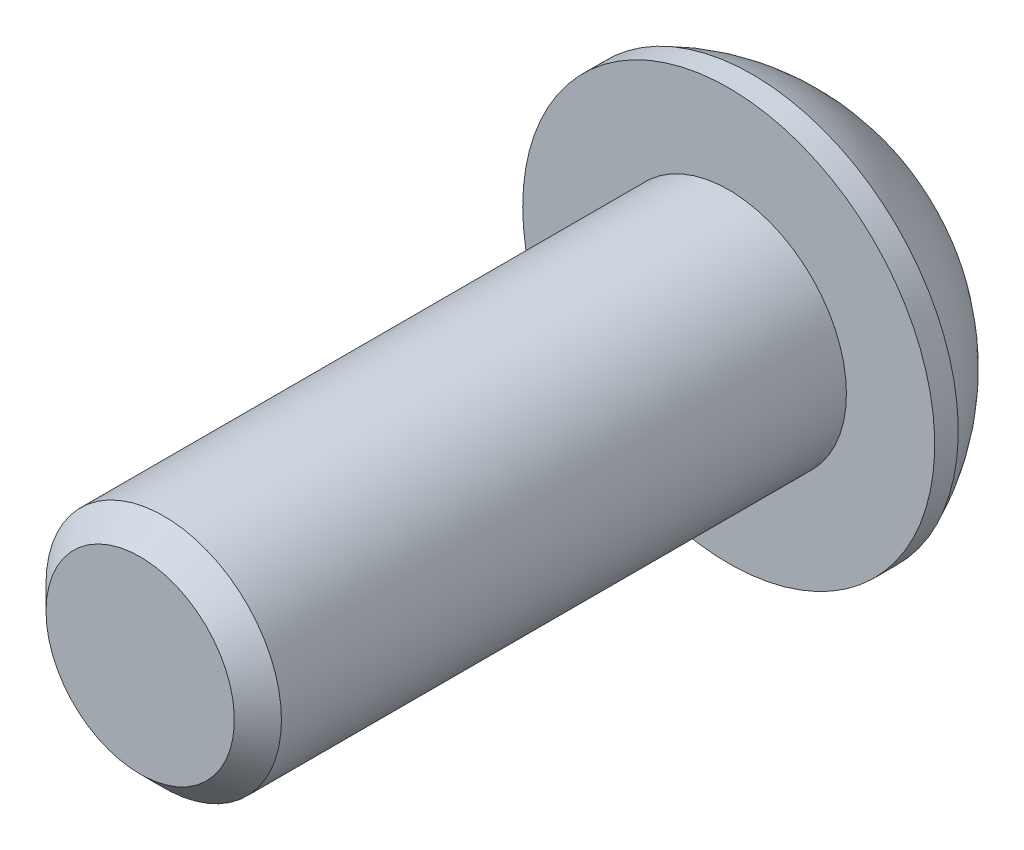
ISO-10303-21;
HEADER;
FILE_DESCRIPTION(('STEP AP214'),'2;1');
FILE_NAME('part.step','',(''),(''),'','','');
FILE_SCHEMA(('AUTOMOTIVE_DESIGN { 1 0 10303 214 1 1 1 1 }'));
ENDSEC;
DATA;
#1=APPLICATION_CONTEXT('core data for automotive mechanical design processes');
#2=APPLICATION_PROTOCOL_DEFINITION('international standard','automotive_design',2000,#1);
#3=PRODUCT_CONTEXT('',#1,'mechanical');
#4=PRODUCT('Part','Part','',(#3));
#5=PRODUCT_RELATED_PRODUCT_CATEGORY('part','',(#4));
#6=PRODUCT_DEFINITION_FORMATION('','',#4);
#7=PRODUCT_DEFINITION_CONTEXT('part definition',#1,'design');
#8=PRODUCT_DEFINITION('design','',#6,#7);
#9=PRODUCT_DEFINITION_SHAPE('','',#8);
#10=(LENGTH_UNIT() NAMED_UNIT(*) SI_UNIT(.MILLI.,.METRE.));
#11=(NAMED_UNIT(*) PLANE_ANGLE_UNIT() SI_UNIT($,.RADIAN.));
#12=(NAMED_UNIT(*) SI_UNIT($,.STERADIAN.) SOLID_ANGLE_UNIT());
#13=UNCERTAINTY_MEASURE_WITH_UNIT(LENGTH_MEASURE(1.E-05),#10,'distance_accuracy_value','');
#14=(GEOMETRIC_REPRESENTATION_CONTEXT(3) GLOBAL_UNCERTAINTY_ASSIGNED_CONTEXT((#13)) GLOBAL_UNIT_ASSIGNED_CONTEXT((#10,
#11,#12)) REPRESENTATION_CONTEXT('',''));
#15=CARTESIAN_POINT('',(0.,0.,0.));
#16=DIRECTION('',(0.,0.,1.));
#17=DIRECTION('',(1.,0.,0.));
#18=AXIS2_PLACEMENT_3D('',#15,#16,#17);
#19=CARTESIAN_POINT('',(0.,0.,-2.1));
#20=DIRECTION('',(0.,0.,1.));
#21=DIRECTION('',(1.,0.,0.));
#22=AXIS2_PLACEMENT_3D('',#19,#20,#21);
#23=PLANE('',#22);
#24=DIRECTION('',(0.866025403784439,0.499999999999999,0.));
#25=VECTOR('',#24,1.);
#26=CARTESIAN_POINT('',(2.5,-1.44337567297406,-2.1));
#27=LINE('',#26,#25);
#28=CARTESIAN_POINT('',(2.5,-1.44337567297406,-2.1));
#29=VERTEX_POINT('',#28);
#30=CARTESIAN_POINT('',(0.,-2.88675134594813,-2.1));
#31=VERTEX_POINT('',#30);
#32=EDGE_CURVE('E156',#29,#31,#27,.F.);
#33=ORIENTED_EDGE('',*,*,#32,.T.);
#34=DIRECTION('',(0.866025403784438,-0.5,0.));
#35=VECTOR('',#34,1.);
#36=CARTESIAN_POINT('',(0.,-2.88675134594813,-2.1));
#37=LINE('',#36,#35);
#38=CARTESIAN_POINT('',(-2.5,-1.44337567297406,-2.1));
#39=VERTEX_POINT('',#38);
#40=EDGE_CURVE('E69',#31,#39,#37,.F.);
#41=ORIENTED_EDGE('',*,*,#40,.T.);
#42=DIRECTION('',(0.,1.,0.));
#43=VECTOR('',#42,1.);
#44=CARTESIAN_POINT('',(-2.5,-1.44337567297406,-2.1));
#45=LINE('',#44,#43);
#46=CARTESIAN_POINT('',(-2.5,1.44337567297407,-2.1));
#47=VERTEX_POINT('',#46);
#48=EDGE_CURVE('E71',#39,#47,#45,.T.);
#49=ORIENTED_EDGE('',*,*,#48,.T.);
#50=DIRECTION('',(-0.866025403784439,-0.5,0.));
#51=VECTOR('',#50,1.);
#52=CARTESIAN_POINT('',(-2.5,1.44337567297407,-2.1));
#53=LINE('',#52,#51);
#54=CARTESIAN_POINT('',(0.,2.88675134594813,-2.1));
#55=VERTEX_POINT('',#54);
#56=EDGE_CURVE('E73',#47,#55,#53,.F.);
#57=ORIENTED_EDGE('',*,*,#56,.T.);
#58=DIRECTION('',(-0.866025403784439,0.5,0.));
#59=VECTOR('',#58,1.);
#60=CARTESIAN_POINT('',(0.,2.88675134594813,-2.1));
#61=LINE('',#60,#59);
#62=CARTESIAN_POINT('',(2.5,1.44337567297406,-2.1));
#63=VERTEX_POINT('',#62);
#64=EDGE_CURVE('E142',#55,#63,#61,.F.);
#65=ORIENTED_EDGE('',*,*,#64,.T.);
#66=DIRECTION('',(0.,1.,0.));
#67=VECTOR('',#66,1.);
#68=CARTESIAN_POINT('',(2.5,1.44337567297406,-2.1));
#69=LINE('',#68,#67);
#70=EDGE_CURVE('E150',#63,#29,#69,.F.);
#71=ORIENTED_EDGE('',*,*,#70,.T.);
#72=EDGE_LOOP('',(#33,#41,#49,#57,#65,#71));
#73=FACE_BOUND('',#72,.T.);
#74=ADVANCED_FACE('F17',(#73),#23,.F.);
#75=CARTESIAN_POINT('',(-2.5,1.44337567297407,-4.4));
#76=DIRECTION('',(-0.5,0.866025403784439,0.));
#77=DIRECTION('',(-0.866025403784439,-0.5,0.));
#78=AXIS2_PLACEMENT_3D('',#75,#76,#77);
#79=PLANE('',#78);
#80=ORIENTED_EDGE('',*,*,#56,.F.);
#81=DIRECTION('',(0.,0.,1.));
#82=VECTOR('',#81,1.);
#83=CARTESIAN_POINT('',(-2.5,1.44337567297407,-4.4));
#84=LINE('',#83,#82);
#85=CARTESIAN_POINT('',(-2.5,1.44337567297407,-4.4));
#86=VERTEX_POINT('',#85);
#87=EDGE_CURVE('E79',#47,#86,#84,.F.);
#88=ORIENTED_EDGE('',*,*,#87,.T.);
#89=DIRECTION('',(-0.866025403784438,-0.500000000000001,0.));
#90=VECTOR('',#89,1.);
#91=CARTESIAN_POINT('',(0.,2.88675134594813,-4.4));
#92=LINE('',#91,#90);
#93=CARTESIAN_POINT('',(0.,2.88675134594813,-4.4));
#94=VERTEX_POINT('',#93);
#95=EDGE_CURVE('E138',#94,#86,#92,.T.);
#96=ORIENTED_EDGE('',*,*,#95,.F.);
#97=DIRECTION('',(0.,0.,1.));
#98=VECTOR('',#97,1.);
#99=CARTESIAN_POINT('',(0.,2.88675134594813,-4.4));
#100=LINE('',#99,#98);
#101=EDGE_CURVE('E85',#94,#55,#100,.T.);
#102=ORIENTED_EDGE('',*,*,#101,.T.);
#103=EDGE_LOOP('',(#80,#88,#96,#102));
#104=FACE_BOUND('',#103,.T.);
#105=ADVANCED_FACE('F82',(#104),#79,.F.);
#106=CARTESIAN_POINT('',(-2.5,-1.44337567297406,-4.4));
#107=DIRECTION('',(-1.,0.,0.));
#108=DIRECTION('',(0.,0.,1.));
#109=AXIS2_PLACEMENT_3D('',#106,#107,#108);
#110=PLANE('',#109);
#111=ORIENTED_EDGE('',*,*,#48,.F.);
#112=DIRECTION('',(0.,0.,1.));
#113=VECTOR('',#112,1.);
#114=CARTESIAN_POINT('',(-2.5,-1.44337567297406,-4.4));
#115=LINE('',#114,#113);
#116=CARTESIAN_POINT('',(-2.5,-1.44337567297406,-4.4));
#117=VERTEX_POINT('',#116);
#118=EDGE_CURVE('E98',#39,#117,#115,.F.);
#119=ORIENTED_EDGE('',*,*,#118,.T.);
#120=DIRECTION('',(0.,1.,0.));
#121=VECTOR('',#120,1.);
#122=CARTESIAN_POINT('',(-2.5,-1.75,-4.4));
#123=LINE('',#122,#121);
#124=EDGE_CURVE('E91',#86,#117,#123,.F.);
#125=ORIENTED_EDGE('',*,*,#124,.F.);
#126=ORIENTED_EDGE('',*,*,#87,.F.);
#127=EDGE_LOOP('',(#111,#119,#125,#126));
#128=FACE_BOUND('',#127,.T.);
#129=ADVANCED_FACE('F89',(#128),#110,.F.);
#130=CARTESIAN_POINT('',(0.,-2.88675134594813,-4.4));
#131=DIRECTION('',(-0.5,-0.866025403784438,0.));
#132=DIRECTION('',(0.866025403784438,-0.5,0.));
#133=AXIS2_PLACEMENT_3D('',#130,#131,#132);
#134=PLANE('',#133);
#135=ORIENTED_EDGE('',*,*,#40,.F.);
#136=DIRECTION('',(0.,0.,1.));
#137=VECTOR('',#136,1.);
#138=CARTESIAN_POINT('',(0.,-2.88675134594812,-4.4));
#139=LINE('',#138,#137);
#140=CARTESIAN_POINT('',(0.,-2.88675134594813,-4.4));
#141=VERTEX_POINT('',#140);
#142=EDGE_CURVE('E153',#31,#141,#139,.F.);
#143=ORIENTED_EDGE('',*,*,#142,.T.);
#144=DIRECTION('',(0.866025403784438,-0.500000000000002,0.));
#145=VECTOR('',#144,1.);
#146=CARTESIAN_POINT('',(-2.5,-1.44337567297406,-4.4));
#147=LINE('',#146,#145);
#148=EDGE_CURVE('E133',#117,#141,#147,.T.);
#149=ORIENTED_EDGE('',*,*,#148,.F.);
#150=ORIENTED_EDGE('',*,*,#118,.F.);
#151=EDGE_LOOP('',(#135,#143,#149,#150));
#152=FACE_BOUND('',#151,.T.);
#153=ADVANCED_FACE('F161',(#152),#134,.F.);
#154=CARTESIAN_POINT('',(2.5,-1.44337567297406,-4.4));
#155=DIRECTION('',(0.499999999999999,-0.866025403784439,0.));
#156=DIRECTION('',(0.866025403784439,0.499999999999999,0.));
#157=AXIS2_PLACEMENT_3D('',#154,#155,#156);
#158=PLANE('',#157);
#159=ORIENTED_EDGE('',*,*,#32,.F.);
#160=DIRECTION('',(0.,0.,-1.));
#161=VECTOR('',#160,1.);
#162=CARTESIAN_POINT('',(2.5,-1.44337567297406,-4.4));
#163=LINE('',#162,#161);
#164=CARTESIAN_POINT('',(2.5,-1.44337567297406,-4.4));
#165=VERTEX_POINT('',#164);
#166=EDGE_CURVE('E147',#29,#165,#163,.T.);
#167=ORIENTED_EDGE('',*,*,#166,.T.);
#168=DIRECTION('',(0.866025403784438,0.500000000000001,0.));
#169=VECTOR('',#168,1.);
#170=CARTESIAN_POINT('',(0.,-2.88675134594813,-4.4));
#171=LINE('',#170,#169);
#172=EDGE_CURVE('E129',#141,#165,#171,.T.);
#173=ORIENTED_EDGE('',*,*,#172,.F.);
#174=ORIENTED_EDGE('',*,*,#142,.F.);
#175=EDGE_LOOP('',(#159,#167,#173,#174));
#176=FACE_BOUND('',#175,.T.);
#177=ADVANCED_FACE('F173',(#176),#158,.F.);
#178=CARTESIAN_POINT('',(2.5,1.44337567297406,-4.4));
#179=DIRECTION('',(1.,0.,0.));
#180=DIRECTION('',(0.,0.,-1.));
#181=AXIS2_PLACEMENT_3D('',#178,#179,#180);
#182=PLANE('',#181);
#183=ORIENTED_EDGE('',*,*,#70,.F.);
#184=DIRECTION('',(0.,0.,1.));
#185=VECTOR('',#184,1.);
#186=CARTESIAN_POINT('',(2.5,1.44337567297406,-4.4));
#187=LINE('',#186,#185);
#188=CARTESIAN_POINT('',(2.5,1.44337567297406,-4.4));
#189=VERTEX_POINT('',#188);
#190=EDGE_CURVE('E36',#63,#189,#187,.F.);
#191=ORIENTED_EDGE('',*,*,#190,.T.);
#192=DIRECTION('',(0.,1.,0.));
#193=VECTOR('',#192,1.);
#194=CARTESIAN_POINT('',(2.5,-1.75,-4.4));
#195=LINE('',#194,#193);
#196=EDGE_CURVE('E125',#165,#189,#195,.T.);
#197=ORIENTED_EDGE('',*,*,#196,.F.);
#198=ORIENTED_EDGE('',*,*,#166,.F.);
#199=EDGE_LOOP('',(#183,#191,#197,#198));
#200=FACE_BOUND('',#199,.T.);
#201=ADVANCED_FACE('F171',(#200),#182,.F.);
#202=CARTESIAN_POINT('',(0.,2.88675134594813,-4.4));
#203=DIRECTION('',(0.5,0.866025403784439,0.));
#204=DIRECTION('',(-0.866025403784439,0.5,0.));
#205=AXIS2_PLACEMENT_3D('',#202,#203,#204);
#206=PLANE('',#205);
#207=ORIENTED_EDGE('',*,*,#64,.F.);
#208=ORIENTED_EDGE('',*,*,#101,.F.);
#209=DIRECTION('',(-0.866025403784438,0.500000000000002,0.));
#210=VECTOR('',#209,1.);
#211=CARTESIAN_POINT('',(2.5,1.44337567297406,-4.4));
#212=LINE('',#211,#210);
#213=EDGE_CURVE('E120',#189,#94,#212,.T.);
#214=ORIENTED_EDGE('',*,*,#213,.F.);
#215=ORIENTED_EDGE('',*,*,#190,.F.);
#216=EDGE_LOOP('',(#207,#208,#214,#215));
#217=FACE_BOUND('',#216,.T.);
#218=ADVANCED_FACE('F168',(#217),#206,.F.);
#219=CARTESIAN_POINT('',(0.,-1.75,-4.4));
#220=DIRECTION('',(0.,0.,-1.));
#221=DIRECTION('',(-1.,0.,0.));
#222=AXIS2_PLACEMENT_3D('',#219,#220,#221);
#223=PLANE('',#222);
#224=ORIENTED_EDGE('',*,*,#196,.T.);
#225=ORIENTED_EDGE('',*,*,#213,.T.);
#226=ORIENTED_EDGE('',*,*,#95,.T.);
#227=ORIENTED_EDGE('',*,*,#124,.T.);
#228=ORIENTED_EDGE('',*,*,#148,.T.);
#229=ORIENTED_EDGE('',*,*,#172,.T.);
#230=EDGE_LOOP('',(#224,#225,#226,#227,#228,#229));
#231=FACE_BOUND('',#230,.T.);
#232=CARTESIAN_POINT('',(0.,0.,-4.4));
#233=DIRECTION('',(0.,0.,-1.));
#234=DIRECTION('',(-1.,0.,0.));
#235=AXIS2_PLACEMENT_3D('',#232,#233,#234);
#236=CIRCLE('',#235,3.5);
#237=CARTESIAN_POINT('',(-3.5,0.,-4.4));
#238=VERTEX_POINT('',#237);
#239=EDGE_CURVE('E20',#238,#238,#236,.F.);
#240=ORIENTED_EDGE('',*,*,#239,.F.);
#241=EDGE_LOOP('',(#240));
#242=FACE_BOUND('',#241,.T.);
#243=ADVANCED_FACE('F165',(#231,#242),#223,.T.);
#244=CARTESIAN_POINT('',(0.,0.,2.17249999999999));
#245=DIRECTION('',(0.,0.,-1.));
#246=DIRECTION('',(0.,-1.,0.));
#247=AXIS2_PLACEMENT_3D('',#244,#245,#246);
#248=DEGENERATE_TOROIDAL_SURFACE('',#247,0.341142857142867,7.29219683627502,.T.);
#249=CARTESIAN_POINT('',(0.,0.,-0.800000000000004));
#250=DIRECTION('',(0.,0.,-1.));
#251=DIRECTION('',(-1.,0.,0.));
#252=AXIS2_PLACEMENT_3D('',#249,#250,#251);
#253=CIRCLE('',#252,7.);
#254=CARTESIAN_POINT('',(-7.,0.,-0.800000000000004));
#255=VERTEX_POINT('',#254);
#256=EDGE_CURVE('E108',#255,#255,#253,.F.);
#257=ORIENTED_EDGE('',*,*,#256,.F.);
#258=EDGE_LOOP('',(#257));
#259=FACE_BOUND('',#258,.T.);
#260=ORIENTED_EDGE('',*,*,#239,.T.);
#261=EDGE_LOOP('',(#260));
#262=FACE_BOUND('',#261,.T.);
#263=ADVANCED_FACE('F204',(#259,#262),#248,.T.);
#264=CARTESIAN_POINT('',(0.,0.,20.));
#265=DIRECTION('',(0.,0.,1.));
#266=DIRECTION('',(1.,0.,0.));
#267=AXIS2_PLACEMENT_3D('',#264,#265,#266);
#268=PLANE('',#267);
#269=CARTESIAN_POINT('',(0.,0.,19.999999999925));
#270=DIRECTION('',(0.,0.,-1.));
#271=DIRECTION('',(-1.,0.,0.));
#272=AXIS2_PLACEMENT_3D('',#269,#270,#271);
#273=CIRCLE('',#272,3.1999999999357);
#274=CARTESIAN_POINT('',(-3.1999999999357,0.,19.999999999925));
#275=VERTEX_POINT('',#274);
#276=EDGE_CURVE('E105',#275,#275,#273,.T.);
#277=ORIENTED_EDGE('',*,*,#276,.F.);
#278=EDGE_LOOP('',(#277));
#279=FACE_BOUND('',#278,.T.);
#280=ADVANCED_FACE('F200',(#279),#268,.T.);
#281=CARTESIAN_POINT('',(0.,0.,-0.4));
#282=DIRECTION('',(0.,0.,-1.));
#283=DIRECTION('',(-1.,0.,0.));
#284=AXIS2_PLACEMENT_3D('',#281,#282,#283);
#285=CYLINDRICAL_SURFACE('',#284,7.);
#286=CARTESIAN_POINT('',(0.,0.,0.));
#287=DIRECTION('',(0.,0.,-1.));
#288=DIRECTION('',(-1.,0.,0.));
#289=AXIS2_PLACEMENT_3D('',#286,#287,#288);
#290=CIRCLE('',#289,7.);
#291=CARTESIAN_POINT('',(-7.,0.,0.));
#292=VERTEX_POINT('',#291);
#293=EDGE_CURVE('E102',#292,#292,#290,.T.);
#294=ORIENTED_EDGE('',*,*,#293,.T.);
#295=EDGE_LOOP('',(#294));
#296=FACE_BOUND('',#295,.T.);
#297=ORIENTED_EDGE('',*,*,#256,.T.);
#298=EDGE_LOOP('',(#297));
#299=FACE_BOUND('',#298,.T.);
#300=ADVANCED_FACE('F196',(#296,#299),#285,.T.);
#301=CARTESIAN_POINT('',(0.,0.,19.2000000000689));
#302=DIRECTION('',(0.,0.,-1.));
#303=DIRECTION('',(-1.,0.,0.));
#304=AXIS2_PLACEMENT_3D('',#301,#302,#303);
#305=CONICAL_SURFACE('',#304,3.99999999984857,0.785398163432975);
#306=CARTESIAN_POINT('',(0.,0.,19.2));
#307=DIRECTION('',(0.,0.,1.));
#308=DIRECTION('',(1.,0.,0.));
#309=AXIS2_PLACEMENT_3D('',#306,#307,#308);
#310=CIRCLE('',#309,4.);
#311=CARTESIAN_POINT('',(4.,0.,19.2));
#312=VERTEX_POINT('',#311);
#313=EDGE_CURVE('E27',#312,#312,#310,.F.);
#314=ORIENTED_EDGE('',*,*,#313,.F.);
#315=EDGE_LOOP('',(#314));
#316=FACE_BOUND('',#315,.T.);
#317=ORIENTED_EDGE('',*,*,#276,.T.);
#318=EDGE_LOOP('',(#317));
#319=FACE_BOUND('',#318,.T.);
#320=ADVANCED_FACE('F189',(#316,#319),#305,.T.);
#321=CARTESIAN_POINT('',(0.,-3.5,0.));
#322=DIRECTION('',(0.,0.,-1.));
#323=DIRECTION('',(-1.,0.,0.));
#324=AXIS2_PLACEMENT_3D('',#321,#322,#323);
#325=PLANE('',#324);
#326=CARTESIAN_POINT('',(0.,0.,0.));
#327=DIRECTION('',(0.,0.,1.));
#328=DIRECTION('',(1.,0.,0.));
#329=AXIS2_PLACEMENT_3D('',#326,#327,#328);
#330=CIRCLE('',#329,4.);
#331=CARTESIAN_POINT('',(4.,0.,0.));
#332=VERTEX_POINT('',#331);
#333=EDGE_CURVE('E11',#332,#332,#330,.T.);
#334=ORIENTED_EDGE('',*,*,#333,.F.);
#335=EDGE_LOOP('',(#334));
#336=FACE_BOUND('',#335,.T.);
#337=ORIENTED_EDGE('',*,*,#293,.F.);
#338=EDGE_LOOP('',(#337));
#339=FACE_BOUND('',#338,.T.);
#340=ADVANCED_FACE('F184',(#336,#339),#325,.F.);
#341=CARTESIAN_POINT('',(0.,0.,0.));
#342=DIRECTION('',(0.,0.,1.));
#343=DIRECTION('',(1.,0.,0.));
#344=AXIS2_PLACEMENT_3D('',#341,#342,#343);
#345=CYLINDRICAL_SURFACE('',#344,4.);
#346=ORIENTED_EDGE('',*,*,#333,.T.);
#347=EDGE_LOOP('',(#346));
#348=FACE_BOUND('',#347,.T.);
#349=ORIENTED_EDGE('',*,*,#313,.T.);
#350=EDGE_LOOP('',(#349));
#351=FACE_BOUND('',#350,.T.);
#352=ADVANCED_FACE('F182',(#348,#351),#345,.T.);
#353=CLOSED_SHELL('',(#74,#105,#129,#153,#177,#201,#218,#243,#263,#280,#300,#320,#340,#352));
#354=MANIFOLD_SOLID_BREP('B1',#353);
#355=ADVANCED_BREP_SHAPE_REPRESENTATION('',(#18,#354),#14);
#356=SHAPE_DEFINITION_REPRESENTATION(#9,#355);
ENDSEC;
END-ISO-10303-21;
